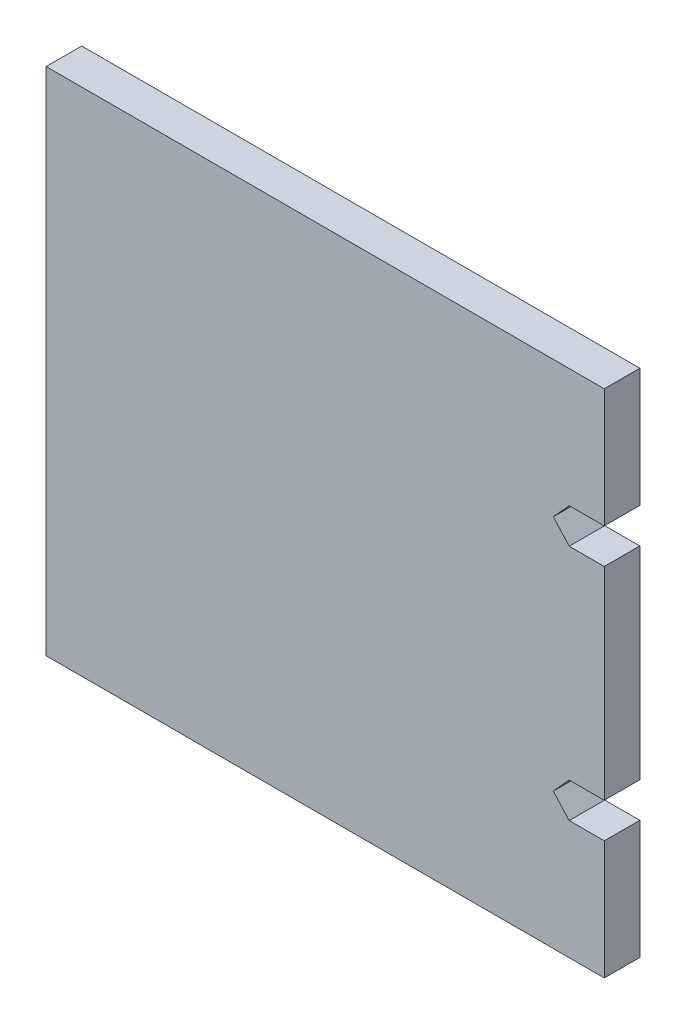
ISO-10303-21;
HEADER;
FILE_DESCRIPTION(('STEP AP214'),'2;1');
FILE_NAME('part.step','',(''),(''),'','','');
FILE_SCHEMA(('AUTOMOTIVE_DESIGN { 1 0 10303 214 1 1 1 1 }'));
ENDSEC;
DATA;
#1=APPLICATION_CONTEXT('core data for automotive mechanical design processes');
#2=APPLICATION_PROTOCOL_DEFINITION('international standard','automotive_design',2000,#1);
#3=PRODUCT_CONTEXT('',#1,'mechanical');
#4=PRODUCT('Part','Part','',(#3));
#5=PRODUCT_RELATED_PRODUCT_CATEGORY('part','',(#4));
#6=PRODUCT_DEFINITION_FORMATION('','',#4);
#7=PRODUCT_DEFINITION_CONTEXT('part definition',#1,'design');
#8=PRODUCT_DEFINITION('design','',#6,#7);
#9=PRODUCT_DEFINITION_SHAPE('','',#8);
#10=(LENGTH_UNIT() NAMED_UNIT(*) SI_UNIT(.MILLI.,.METRE.));
#11=(NAMED_UNIT(*) PLANE_ANGLE_UNIT() SI_UNIT($,.RADIAN.));
#12=(NAMED_UNIT(*) SI_UNIT($,.STERADIAN.) SOLID_ANGLE_UNIT());
#13=UNCERTAINTY_MEASURE_WITH_UNIT(LENGTH_MEASURE(1.E-05),#10,'distance_accuracy_value','');
#14=(GEOMETRIC_REPRESENTATION_CONTEXT(3) GLOBAL_UNCERTAINTY_ASSIGNED_CONTEXT((#13)) GLOBAL_UNIT_ASSIGNED_CONTEXT((#10,
#11,#12)) REPRESENTATION_CONTEXT('',''));
#15=CARTESIAN_POINT('',(0.,0.,0.));
#16=DIRECTION('',(0.,0.,1.));
#17=DIRECTION('',(1.,0.,0.));
#18=AXIS2_PLACEMENT_3D('',#15,#16,#17);
#19=CARTESIAN_POINT('',(350.,0.,22.3));
#20=DIRECTION('',(-1.,0.,0.));
#21=DIRECTION('',(0.,0.,1.));
#22=AXIS2_PLACEMENT_3D('',#19,#20,#21);
#23=PLANE('',#22);
#24=DIRECTION('',(0.,0.,1.));
#25=VECTOR('',#24,1.);
#26=CARTESIAN_POINT('',(350.,223.5,0.));
#27=LINE('',#26,#25);
#28=CARTESIAN_POINT('',(350.,223.5,0.));
#29=VERTEX_POINT('',#28);
#30=CARTESIAN_POINT('',(350.,223.5,22.3));
#31=VERTEX_POINT('',#30);
#32=EDGE_CURVE('E174',#29,#31,#27,.T.);
#33=ORIENTED_EDGE('',*,*,#32,.T.);
#34=DIRECTION('',(0.,1.,0.));
#35=VECTOR('',#34,1.);
#36=CARTESIAN_POINT('',(350.,0.,22.3));
#37=LINE('',#36,#35);
#38=CARTESIAN_POINT('',(350.,96.5000000000001,22.3));
#39=VERTEX_POINT('',#38);
#40=EDGE_CURVE('E222',#39,#31,#37,.T.);
#41=ORIENTED_EDGE('',*,*,#40,.F.);
#42=DIRECTION('',(0.,0.,1.));
#43=VECTOR('',#42,1.);
#44=CARTESIAN_POINT('',(350.,96.5000000000001,0.));
#45=LINE('',#44,#43);
#46=CARTESIAN_POINT('',(350.,96.5000000000001,0.));
#47=VERTEX_POINT('',#46);
#48=EDGE_CURVE('E204',#47,#39,#45,.T.);
#49=ORIENTED_EDGE('',*,*,#48,.F.);
#50=DIRECTION('',(0.,1.,0.));
#51=VECTOR('',#50,1.);
#52=CARTESIAN_POINT('',(350.,0.,0.));
#53=LINE('',#52,#51);
#54=EDGE_CURVE('E232',#47,#29,#53,.T.);
#55=ORIENTED_EDGE('',*,*,#54,.T.);
#56=EDGE_LOOP('',(#33,#41,#49,#55));
#57=FACE_BOUND('',#56,.T.);
#58=ADVANCED_FACE('F34',(#57),#23,.F.);
#59=DIRECTION('',(0.,0.,1.));
#60=VECTOR('',#59,1.);
#61=CARTESIAN_POINT('',(350.,74.5000000000001,0.));
#62=LINE('',#61,#60);
#63=CARTESIAN_POINT('',(350.,74.5000000000001,0.));
#64=VERTEX_POINT('',#63);
#65=CARTESIAN_POINT('',(350.,74.5000000000001,22.3));
#66=VERTEX_POINT('',#65);
#67=EDGE_CURVE('E206',#64,#66,#62,.T.);
#68=ORIENTED_EDGE('',*,*,#67,.T.);
#69=CARTESIAN_POINT('',(350.,0.,22.3));
#70=VERTEX_POINT('',#69);
#71=EDGE_CURVE('E218',#70,#66,#37,.T.);
#72=ORIENTED_EDGE('',*,*,#71,.F.);
#73=DIRECTION('',(0.,0.,-1.));
#74=VECTOR('',#73,1.);
#75=CARTESIAN_POINT('',(350.,0.,22.3));
#76=LINE('',#75,#74);
#77=CARTESIAN_POINT('',(350.,0.,0.));
#78=VERTEX_POINT('',#77);
#79=EDGE_CURVE('E42',#70,#78,#76,.T.);
#80=ORIENTED_EDGE('',*,*,#79,.T.);
#81=EDGE_CURVE('E229',#78,#64,#53,.T.);
#82=ORIENTED_EDGE('',*,*,#81,.T.);
#83=EDGE_LOOP('',(#68,#72,#80,#82));
#84=FACE_BOUND('',#83,.T.);
#85=ADVANCED_FACE('F243',(#84),#23,.F.);
#86=CARTESIAN_POINT('',(0.,0.,22.3));
#87=DIRECTION('',(1.,0.,0.));
#88=DIRECTION('',(0.,0.,-1.));
#89=AXIS2_PLACEMENT_3D('',#86,#87,#88);
#90=PLANE('',#89);
#91=DIRECTION('',(0.,-1.,0.));
#92=VECTOR('',#91,1.);
#93=CARTESIAN_POINT('',(0.,0.,0.));
#94=LINE('',#93,#92);
#95=CARTESIAN_POINT('',(0.,320.,0.));
#96=VERTEX_POINT('',#95);
#97=CARTESIAN_POINT('',(0.,0.,0.));
#98=VERTEX_POINT('',#97);
#99=EDGE_CURVE('E203',#96,#98,#94,.T.);
#100=ORIENTED_EDGE('',*,*,#99,.T.);
#101=DIRECTION('',(0.,0.,-1.));
#102=VECTOR('',#101,1.);
#103=CARTESIAN_POINT('',(0.,0.,22.3));
#104=LINE('',#103,#102);
#105=CARTESIAN_POINT('',(0.,0.,22.3));
#106=VERTEX_POINT('',#105);
#107=EDGE_CURVE('E11',#106,#98,#104,.T.);
#108=ORIENTED_EDGE('',*,*,#107,.F.);
#109=DIRECTION('',(0.,-1.,0.));
#110=VECTOR('',#109,1.);
#111=CARTESIAN_POINT('',(0.,0.,22.3));
#112=LINE('',#111,#110);
#113=CARTESIAN_POINT('',(0.,320.,22.3));
#114=VERTEX_POINT('',#113);
#115=EDGE_CURVE('E211',#114,#106,#112,.T.);
#116=ORIENTED_EDGE('',*,*,#115,.F.);
#117=DIRECTION('',(0.,0.,-1.));
#118=VECTOR('',#117,1.);
#119=CARTESIAN_POINT('',(0.,320.,22.3));
#120=LINE('',#119,#118);
#121=EDGE_CURVE('E224',#114,#96,#120,.T.);
#122=ORIENTED_EDGE('',*,*,#121,.T.);
#123=EDGE_LOOP('',(#100,#108,#116,#122));
#124=FACE_BOUND('',#123,.T.);
#125=ADVANCED_FACE('F36',(#124),#90,.F.);
#126=CARTESIAN_POINT('',(0.,0.,22.3));
#127=DIRECTION('',(0.,1.,0.));
#128=DIRECTION('',(0.,0.,1.));
#129=AXIS2_PLACEMENT_3D('',#126,#127,#128);
#130=PLANE('',#129);
#131=DIRECTION('',(1.,0.,0.));
#132=VECTOR('',#131,1.);
#133=CARTESIAN_POINT('',(0.,0.,0.));
#134=LINE('',#133,#132);
#135=EDGE_CURVE('E227',#98,#78,#134,.T.);
#136=ORIENTED_EDGE('',*,*,#135,.T.);
#137=ORIENTED_EDGE('',*,*,#79,.F.);
#138=DIRECTION('',(1.,0.,0.));
#139=VECTOR('',#138,1.);
#140=CARTESIAN_POINT('',(0.,0.,22.3));
#141=LINE('',#140,#139);
#142=EDGE_CURVE('E214',#106,#70,#141,.T.);
#143=ORIENTED_EDGE('',*,*,#142,.F.);
#144=ORIENTED_EDGE('',*,*,#107,.T.);
#145=EDGE_LOOP('',(#136,#137,#143,#144));
#146=FACE_BOUND('',#145,.T.);
#147=ADVANCED_FACE('F255',(#146),#130,.F.);
#148=CARTESIAN_POINT('',(350.,245.5,22.3));
#149=VERTEX_POINT('',#148);
#150=CARTESIAN_POINT('',(350.,320.,22.3));
#151=VERTEX_POINT('',#150);
#152=EDGE_CURVE('E217',#149,#151,#37,.T.);
#153=ORIENTED_EDGE('',*,*,#152,.F.);
#154=DIRECTION('',(0.,0.,1.));
#155=VECTOR('',#154,1.);
#156=CARTESIAN_POINT('',(350.,245.5,0.));
#157=LINE('',#156,#155);
#158=CARTESIAN_POINT('',(350.,245.5,0.));
#159=VERTEX_POINT('',#158);
#160=EDGE_CURVE('E171',#159,#149,#157,.T.);
#161=ORIENTED_EDGE('',*,*,#160,.F.);
#162=CARTESIAN_POINT('',(350.,320.,0.));
#163=VERTEX_POINT('',#162);
#164=EDGE_CURVE('E157',#159,#163,#53,.T.);
#165=ORIENTED_EDGE('',*,*,#164,.T.);
#166=DIRECTION('',(0.,0.,-1.));
#167=VECTOR('',#166,1.);
#168=CARTESIAN_POINT('',(350.,320.,22.3));
#169=LINE('',#168,#167);
#170=EDGE_CURVE('E236',#151,#163,#169,.T.);
#171=ORIENTED_EDGE('',*,*,#170,.F.);
#172=EDGE_LOOP('',(#153,#161,#165,#171));
#173=FACE_BOUND('',#172,.T.);
#174=ADVANCED_FACE('F264',(#173),#23,.F.);
#175=CARTESIAN_POINT('',(0.,320.,22.3));
#176=DIRECTION('',(0.,-1.,0.));
#177=DIRECTION('',(0.,0.,-1.));
#178=AXIS2_PLACEMENT_3D('',#175,#176,#177);
#179=PLANE('',#178);
#180=DIRECTION('',(-1.,0.,0.));
#181=VECTOR('',#180,1.);
#182=CARTESIAN_POINT('',(0.,320.,0.));
#183=LINE('',#182,#181);
#184=EDGE_CURVE('E215',#163,#96,#183,.T.);
#185=ORIENTED_EDGE('',*,*,#184,.T.);
#186=ORIENTED_EDGE('',*,*,#121,.F.);
#187=DIRECTION('',(-1.,0.,0.));
#188=VECTOR('',#187,1.);
#189=CARTESIAN_POINT('',(0.,320.,22.3));
#190=LINE('',#189,#188);
#191=EDGE_CURVE('E221',#151,#114,#190,.T.);
#192=ORIENTED_EDGE('',*,*,#191,.F.);
#193=ORIENTED_EDGE('',*,*,#170,.T.);
#194=EDGE_LOOP('',(#185,#186,#192,#193));
#195=FACE_BOUND('',#194,.T.);
#196=ADVANCED_FACE('F259',(#195),#179,.F.);
#197=CARTESIAN_POINT('',(0.,0.,22.3));
#198=DIRECTION('',(0.,0.,-1.));
#199=DIRECTION('',(-1.,0.,0.));
#200=AXIS2_PLACEMENT_3D('',#197,#198,#199);
#201=PLANE('',#200);
#202=DIRECTION('',(-0.672672793996309,-0.739940073395946,0.));
#203=VECTOR('',#202,1.);
#204=CARTESIAN_POINT('',(57.3891402714946,-52.1719457013583,22.3));
#205=LINE('',#204,#203);
#206=CARTESIAN_POINT('',(328.,245.5,22.3));
#207=VERTEX_POINT('',#206);
#208=CARTESIAN_POINT('',(318.,234.5,22.3));
#209=VERTEX_POINT('',#208);
#210=EDGE_CURVE('E167',#207,#209,#205,.T.);
#211=ORIENTED_EDGE('',*,*,#210,.F.);
#212=DIRECTION('',(-1.,0.,0.));
#213=VECTOR('',#212,1.);
#214=CARTESIAN_POINT('',(1.54863495764476E-12,245.500000000002,22.3));
#215=LINE('',#214,#213);
#216=EDGE_CURVE('E142',#149,#207,#215,.T.);
#217=ORIENTED_EDGE('',*,*,#216,.F.);
#218=ORIENTED_EDGE('',*,*,#152,.T.);
#219=ORIENTED_EDGE('',*,*,#191,.T.);
#220=ORIENTED_EDGE('',*,*,#115,.T.);
#221=ORIENTED_EDGE('',*,*,#142,.T.);
#222=ORIENTED_EDGE('',*,*,#71,.T.);
#223=DIRECTION('',(-1.,0.,0.));
#224=VECTOR('',#223,1.);
#225=CARTESIAN_POINT('',(-1.40985707956659E-13,74.4999999999994,22.3));
#226=LINE('',#225,#224);
#227=CARTESIAN_POINT('',(328.,74.5,22.3));
#228=VERTEX_POINT('',#227);
#229=EDGE_CURVE('E196',#66,#228,#226,.T.);
#230=ORIENTED_EDGE('',*,*,#229,.T.);
#231=DIRECTION('',(-0.672672793996309,0.739940073395946,0.));
#232=VECTOR('',#231,1.);
#233=CARTESIAN_POINT('',(216.665158371042,196.968325791855,22.3));
#234=LINE('',#233,#232);
#235=CARTESIAN_POINT('',(318.,85.5000000000001,22.3));
#236=VERTEX_POINT('',#235);
#237=EDGE_CURVE('E193',#228,#236,#234,.T.);
#238=ORIENTED_EDGE('',*,*,#237,.T.);
#239=DIRECTION('',(0.672672793996309,0.739940073395946,0.));
#240=VECTOR('',#239,1.);
#241=CARTESIAN_POINT('',(131.552036199096,-119.592760180996,22.3));
#242=LINE('',#241,#240);
#243=CARTESIAN_POINT('',(328.,96.5000000000001,22.3));
#244=VERTEX_POINT('',#243);
#245=EDGE_CURVE('E173',#236,#244,#242,.T.);
#246=ORIENTED_EDGE('',*,*,#245,.T.);
#247=DIRECTION('',(-1.,0.,0.));
#248=VECTOR('',#247,1.);
#249=CARTESIAN_POINT('',(1.21746047586736E-13,96.5000000000005,22.3));
#250=LINE('',#249,#248);
#251=EDGE_CURVE('E183',#39,#244,#250,.T.);
#252=ORIENTED_EDGE('',*,*,#251,.F.);
#253=ORIENTED_EDGE('',*,*,#40,.T.);
#254=DIRECTION('',(-1.,0.,0.));
#255=VECTOR('',#254,1.);
#256=CARTESIAN_POINT('',(-2.8197141591332E-13,223.5,22.3));
#257=LINE('',#256,#255);
#258=CARTESIAN_POINT('',(328.,223.5,22.3));
#259=VERTEX_POINT('',#258);
#260=EDGE_CURVE('E158',#31,#259,#257,.T.);
#261=ORIENTED_EDGE('',*,*,#260,.T.);
#262=DIRECTION('',(0.672672793996309,-0.739940073395946,0.));
#263=VECTOR('',#262,1.);
#264=CARTESIAN_POINT('',(290.828054298644,264.389140271492,22.3));
#265=LINE('',#264,#263);
#266=EDGE_CURVE('E161',#209,#259,#265,.T.);
#267=ORIENTED_EDGE('',*,*,#266,.F.);
#268=EDGE_LOOP('',(#211,#217,#218,#219,#220,#221,#222,#230,#238,#246,#252,#253,#261,#267));
#269=FACE_BOUND('',#268,.T.);
#270=ADVANCED_FACE('F252',(#269),#201,.F.);
#271=CARTESIAN_POINT('',(0.,0.,0.));
#272=DIRECTION('',(0.,0.,-1.));
#273=DIRECTION('',(-1.,0.,0.));
#274=AXIS2_PLACEMENT_3D('',#271,#272,#273);
#275=PLANE('',#274);
#276=DIRECTION('',(-1.,0.,0.));
#277=VECTOR('',#276,1.);
#278=CARTESIAN_POINT('',(1.54863495764476E-12,245.500000000002,0.));
#279=LINE('',#278,#277);
#280=CARTESIAN_POINT('',(328.,245.5,0.));
#281=VERTEX_POINT('',#280);
#282=EDGE_CURVE('E139',#159,#281,#279,.T.);
#283=ORIENTED_EDGE('',*,*,#282,.T.);
#284=DIRECTION('',(-0.672672793996309,-0.739940073395946,0.));
#285=VECTOR('',#284,1.);
#286=CARTESIAN_POINT('',(57.3891402714946,-52.1719457013583,0.));
#287=LINE('',#286,#285);
#288=CARTESIAN_POINT('',(318.,234.5,0.));
#289=VERTEX_POINT('',#288);
#290=EDGE_CURVE('E150',#281,#289,#287,.T.);
#291=ORIENTED_EDGE('',*,*,#290,.T.);
#292=DIRECTION('',(0.672672793996309,-0.739940073395946,0.));
#293=VECTOR('',#292,1.);
#294=CARTESIAN_POINT('',(290.828054298644,264.389140271492,0.));
#295=LINE('',#294,#293);
#296=CARTESIAN_POINT('',(328.,223.5,0.));
#297=VERTEX_POINT('',#296);
#298=EDGE_CURVE('E49',#289,#297,#295,.T.);
#299=ORIENTED_EDGE('',*,*,#298,.T.);
#300=DIRECTION('',(-1.,0.,0.));
#301=VECTOR('',#300,1.);
#302=CARTESIAN_POINT('',(-2.8197141591332E-13,223.5,0.));
#303=LINE('',#302,#301);
#304=EDGE_CURVE('E147',#29,#297,#303,.T.);
#305=ORIENTED_EDGE('',*,*,#304,.F.);
#306=ORIENTED_EDGE('',*,*,#54,.F.);
#307=DIRECTION('',(-1.,0.,0.));
#308=VECTOR('',#307,1.);
#309=CARTESIAN_POINT('',(1.21746047586736E-13,96.5000000000005,0.));
#310=LINE('',#309,#308);
#311=CARTESIAN_POINT('',(328.,96.5000000000001,0.));
#312=VERTEX_POINT('',#311);
#313=EDGE_CURVE('E187',#47,#312,#310,.T.);
#314=ORIENTED_EDGE('',*,*,#313,.T.);
#315=DIRECTION('',(0.672672793996309,0.739940073395946,0.));
#316=VECTOR('',#315,1.);
#317=CARTESIAN_POINT('',(131.552036199096,-119.592760180996,0.));
#318=LINE('',#317,#316);
#319=CARTESIAN_POINT('',(318.,85.5000000000001,0.));
#320=VERTEX_POINT('',#319);
#321=EDGE_CURVE('E180',#320,#312,#318,.T.);
#322=ORIENTED_EDGE('',*,*,#321,.F.);
#323=DIRECTION('',(-0.672672793996309,0.739940073395946,0.));
#324=VECTOR('',#323,1.);
#325=CARTESIAN_POINT('',(216.665158371042,196.968325791855,0.));
#326=LINE('',#325,#324);
#327=CARTESIAN_POINT('',(328.,74.5,0.));
#328=VERTEX_POINT('',#327);
#329=EDGE_CURVE('E182',#328,#320,#326,.T.);
#330=ORIENTED_EDGE('',*,*,#329,.F.);
#331=DIRECTION('',(-1.,0.,0.));
#332=VECTOR('',#331,1.);
#333=CARTESIAN_POINT('',(-1.40985707956659E-13,74.4999999999994,0.));
#334=LINE('',#333,#332);
#335=EDGE_CURVE('E185',#64,#328,#334,.T.);
#336=ORIENTED_EDGE('',*,*,#335,.F.);
#337=ORIENTED_EDGE('',*,*,#81,.F.);
#338=ORIENTED_EDGE('',*,*,#135,.F.);
#339=ORIENTED_EDGE('',*,*,#99,.F.);
#340=ORIENTED_EDGE('',*,*,#184,.F.);
#341=ORIENTED_EDGE('',*,*,#164,.F.);
#342=EDGE_LOOP('',(#283,#291,#299,#305,#306,#314,#322,#330,#336,#337,#338,#339,#340,#341));
#343=FACE_BOUND('',#342,.T.);
#344=ADVANCED_FACE('F155',(#343),#275,.T.);
#345=CARTESIAN_POINT('',(131.552036199096,-119.592760180996,0.));
#346=DIRECTION('',(0.739940073395946,-0.672672793996309,0.));
#347=DIRECTION('',(0.67267279399631,0.739940073395946,0.));
#348=AXIS2_PLACEMENT_3D('',#345,#346,#347);
#349=PLANE('',#348);
#350=ORIENTED_EDGE('',*,*,#245,.F.);
#351=DIRECTION('',(0.,0.,1.));
#352=VECTOR('',#351,1.);
#353=CARTESIAN_POINT('',(318.,85.5000000000001,0.));
#354=LINE('',#353,#352);
#355=EDGE_CURVE('E190',#320,#236,#354,.T.);
#356=ORIENTED_EDGE('',*,*,#355,.F.);
#357=ORIENTED_EDGE('',*,*,#321,.T.);
#358=DIRECTION('',(0.,0.,1.));
#359=VECTOR('',#358,1.);
#360=CARTESIAN_POINT('',(328.,96.5000000000001,0.));
#361=LINE('',#360,#359);
#362=EDGE_CURVE('E201',#312,#244,#361,.T.);
#363=ORIENTED_EDGE('',*,*,#362,.T.);
#364=EDGE_LOOP('',(#350,#356,#357,#363));
#365=FACE_BOUND('',#364,.T.);
#366=ADVANCED_FACE('F282',(#365),#349,.T.);
#367=CARTESIAN_POINT('',(1.21746047586736E-13,96.5000000000005,0.));
#368=DIRECTION('',(0.,1.,0.));
#369=DIRECTION('',(-1.,0.,0.));
#370=AXIS2_PLACEMENT_3D('',#367,#368,#369);
#371=PLANE('',#370);
#372=ORIENTED_EDGE('',*,*,#251,.T.);
#373=ORIENTED_EDGE('',*,*,#362,.F.);
#374=ORIENTED_EDGE('',*,*,#313,.F.);
#375=ORIENTED_EDGE('',*,*,#48,.T.);
#376=EDGE_LOOP('',(#372,#373,#374,#375));
#377=FACE_BOUND('',#376,.T.);
#378=ADVANCED_FACE('F280',(#377),#371,.F.);
#379=CARTESIAN_POINT('',(-1.40985707956659E-13,74.4999999999994,0.));
#380=DIRECTION('',(0.,1.,0.));
#381=DIRECTION('',(-1.,0.,0.));
#382=AXIS2_PLACEMENT_3D('',#379,#380,#381);
#383=PLANE('',#382);
#384=ORIENTED_EDGE('',*,*,#229,.F.);
#385=ORIENTED_EDGE('',*,*,#67,.F.);
#386=ORIENTED_EDGE('',*,*,#335,.T.);
#387=DIRECTION('',(0.,0.,1.));
#388=VECTOR('',#387,1.);
#389=CARTESIAN_POINT('',(328.,74.5,0.));
#390=LINE('',#389,#388);
#391=EDGE_CURVE('E57',#328,#228,#390,.T.);
#392=ORIENTED_EDGE('',*,*,#391,.T.);
#393=EDGE_LOOP('',(#384,#385,#386,#392));
#394=FACE_BOUND('',#393,.T.);
#395=ADVANCED_FACE('F250',(#394),#383,.T.);
#396=CARTESIAN_POINT('',(216.665158371042,196.968325791855,0.));
#397=DIRECTION('',(0.739940073395946,0.672672793996309,0.));
#398=DIRECTION('',(-0.67267279399631,0.739940073395946,0.));
#399=AXIS2_PLACEMENT_3D('',#396,#397,#398);
#400=PLANE('',#399);
#401=ORIENTED_EDGE('',*,*,#237,.F.);
#402=ORIENTED_EDGE('',*,*,#391,.F.);
#403=ORIENTED_EDGE('',*,*,#329,.T.);
#404=ORIENTED_EDGE('',*,*,#355,.T.);
#405=EDGE_LOOP('',(#401,#402,#403,#404));
#406=FACE_BOUND('',#405,.T.);
#407=ADVANCED_FACE('F284',(#406),#400,.T.);
#408=CARTESIAN_POINT('',(1.54863495764476E-12,245.500000000002,0.));
#409=DIRECTION('',(0.,1.,0.));
#410=DIRECTION('',(-1.,0.,0.));
#411=AXIS2_PLACEMENT_3D('',#408,#409,#410);
#412=PLANE('',#411);
#413=ORIENTED_EDGE('',*,*,#216,.T.);
#414=DIRECTION('',(0.,0.,1.));
#415=VECTOR('',#414,1.);
#416=CARTESIAN_POINT('',(328.,245.5,0.));
#417=LINE('',#416,#415);
#418=EDGE_CURVE('E135',#281,#207,#417,.T.);
#419=ORIENTED_EDGE('',*,*,#418,.F.);
#420=ORIENTED_EDGE('',*,*,#282,.F.);
#421=ORIENTED_EDGE('',*,*,#160,.T.);
#422=EDGE_LOOP('',(#413,#419,#420,#421));
#423=FACE_BOUND('',#422,.T.);
#424=ADVANCED_FACE('F137',(#423),#412,.F.);
#425=CARTESIAN_POINT('',(-2.8197141591332E-13,223.5,0.));
#426=DIRECTION('',(0.,1.,0.));
#427=DIRECTION('',(-1.,0.,0.));
#428=AXIS2_PLACEMENT_3D('',#425,#426,#427);
#429=PLANE('',#428);
#430=ORIENTED_EDGE('',*,*,#260,.F.);
#431=ORIENTED_EDGE('',*,*,#32,.F.);
#432=ORIENTED_EDGE('',*,*,#304,.T.);
#433=DIRECTION('',(0.,0.,1.));
#434=VECTOR('',#433,1.);
#435=CARTESIAN_POINT('',(328.,223.5,0.));
#436=LINE('',#435,#434);
#437=EDGE_CURVE('E177',#297,#259,#436,.T.);
#438=ORIENTED_EDGE('',*,*,#437,.T.);
#439=EDGE_LOOP('',(#430,#431,#432,#438));
#440=FACE_BOUND('',#439,.T.);
#441=ADVANCED_FACE('F273',(#440),#429,.T.);
#442=CARTESIAN_POINT('',(290.828054298644,264.389140271492,0.));
#443=DIRECTION('',(-0.739940073395946,-0.672672793996309,0.));
#444=DIRECTION('',(0.67267279399631,-0.739940073395946,0.));
#445=AXIS2_PLACEMENT_3D('',#442,#443,#444);
#446=PLANE('',#445);
#447=ORIENTED_EDGE('',*,*,#266,.T.);
#448=ORIENTED_EDGE('',*,*,#437,.F.);
#449=ORIENTED_EDGE('',*,*,#298,.F.);
#450=DIRECTION('',(0.,0.,1.));
#451=VECTOR('',#450,1.);
#452=CARTESIAN_POINT('',(318.,234.5,0.));
#453=LINE('',#452,#451);
#454=EDGE_CURVE('E146',#289,#209,#453,.T.);
#455=ORIENTED_EDGE('',*,*,#454,.T.);
#456=EDGE_LOOP('',(#447,#448,#449,#455));
#457=FACE_BOUND('',#456,.T.);
#458=ADVANCED_FACE('F274',(#457),#446,.F.);
#459=CARTESIAN_POINT('',(57.3891402714946,-52.1719457013583,0.));
#460=DIRECTION('',(-0.739940073395946,0.672672793996309,0.));
#461=DIRECTION('',(-0.67267279399631,-0.739940073395946,0.));
#462=AXIS2_PLACEMENT_3D('',#459,#460,#461);
#463=PLANE('',#462);
#464=ORIENTED_EDGE('',*,*,#210,.T.);
#465=ORIENTED_EDGE('',*,*,#454,.F.);
#466=ORIENTED_EDGE('',*,*,#290,.F.);
#467=ORIENTED_EDGE('',*,*,#418,.T.);
#468=EDGE_LOOP('',(#464,#465,#466,#467));
#469=FACE_BOUND('',#468,.T.);
#470=ADVANCED_FACE('F151',(#469),#463,.F.);
#471=CLOSED_SHELL('',(#58,#85,#125,#147,#174,#196,#270,#344,#366,#378,#395,#407,#424,#441,#458,#470));
#472=MANIFOLD_SOLID_BREP('B2',#471);
#473=ADVANCED_BREP_SHAPE_REPRESENTATION('',(#18,#472),#14);
#474=SHAPE_DEFINITION_REPRESENTATION(#9,#473);
ENDSEC;
END-ISO-10303-21;
